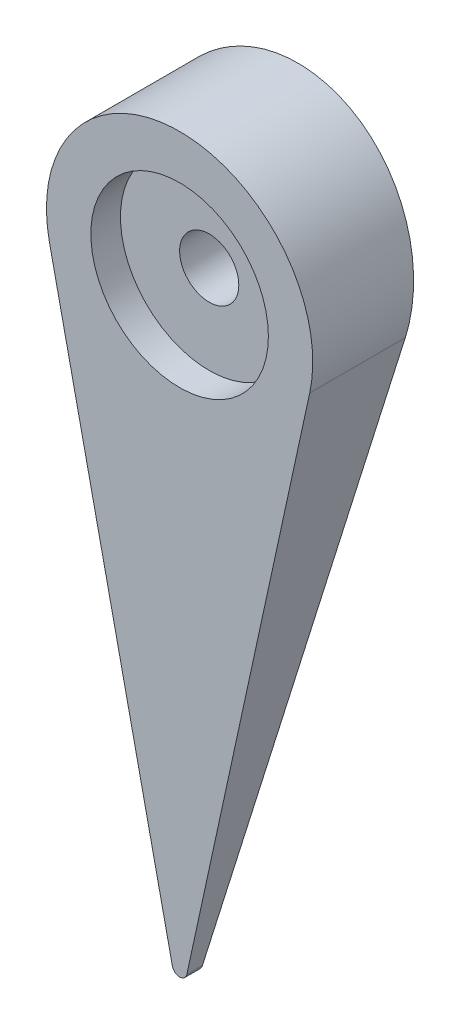
ISO-10303-21;
HEADER;
FILE_DESCRIPTION(('STEP AP214'),'2;1');
FILE_NAME('part.step','',(''),(''),'','','');
FILE_SCHEMA(('AUTOMOTIVE_DESIGN { 1 0 10303 214 1 1 1 1 }'));
ENDSEC;
DATA;
#1=APPLICATION_CONTEXT('core data for automotive mechanical design processes');
#2=APPLICATION_PROTOCOL_DEFINITION('international standard','automotive_design',2000,#1);
#3=PRODUCT_CONTEXT('',#1,'mechanical');
#4=PRODUCT('Part','Part','',(#3));
#5=PRODUCT_RELATED_PRODUCT_CATEGORY('part','',(#4));
#6=PRODUCT_DEFINITION_FORMATION('','',#4);
#7=PRODUCT_DEFINITION_CONTEXT('part definition',#1,'design');
#8=PRODUCT_DEFINITION('design','',#6,#7);
#9=PRODUCT_DEFINITION_SHAPE('','',#8);
#10=(LENGTH_UNIT() NAMED_UNIT(*) SI_UNIT(.MILLI.,.METRE.));
#11=(NAMED_UNIT(*) PLANE_ANGLE_UNIT() SI_UNIT($,.RADIAN.));
#12=(NAMED_UNIT(*) SI_UNIT($,.STERADIAN.) SOLID_ANGLE_UNIT());
#13=UNCERTAINTY_MEASURE_WITH_UNIT(LENGTH_MEASURE(1.E-05),#10,'distance_accuracy_value','');
#14=(GEOMETRIC_REPRESENTATION_CONTEXT(3) GLOBAL_UNCERTAINTY_ASSIGNED_CONTEXT((#13)) GLOBAL_UNIT_ASSIGNED_CONTEXT((#10,
#11,#12)) REPRESENTATION_CONTEXT('',''));
#15=CARTESIAN_POINT('',(0.,0.,0.));
#16=DIRECTION('',(0.,0.,1.));
#17=DIRECTION('',(1.,0.,0.));
#18=AXIS2_PLACEMENT_3D('',#15,#16,#17);
#19=CARTESIAN_POINT('',(0.,0.,5.));
#20=DIRECTION('',(0.,0.,-1.));
#21=DIRECTION('',(-1.,0.,0.));
#22=AXIS2_PLACEMENT_3D('',#19,#20,#21);
#23=CYLINDRICAL_SURFACE('',#22,1.);
#24=CARTESIAN_POINT('',(0.,0.,1.63636363636364));
#25=DIRECTION('',(0.,-0.140021004726182,-0.990148533420855));
#26=DIRECTION('',(0.,0.990148533420855,-0.140021004726182));
#27=AXIS2_PLACEMENT_3D('',#24,#25,#26);
#28=ELLIPSE('',#27,1.00994948358415,1.);
#29=CARTESIAN_POINT('',(0.,1.,1.49494949494949));
#30=VERTEX_POINT('',#29);
#31=EDGE_CURVE('E96',#30,#30,#28,.T.);
#32=ORIENTED_EDGE('',*,*,#31,.T.);
#33=EDGE_LOOP('',(#32));
#34=FACE_BOUND('',#33,.T.);
#35=CARTESIAN_POINT('',(0.,0.,4.));
#36=DIRECTION('',(0.,0.,1.));
#37=DIRECTION('',(1.,0.,0.));
#38=AXIS2_PLACEMENT_3D('',#35,#36,#37);
#39=CIRCLE('',#38,1.);
#40=CARTESIAN_POINT('',(1.,0.,4.));
#41=VERTEX_POINT('',#40);
#42=EDGE_CURVE('E49',#41,#41,#39,.T.);
#43=ORIENTED_EDGE('',*,*,#42,.T.);
#44=EDGE_LOOP('',(#43));
#45=FACE_BOUND('',#44,.T.);
#46=ADVANCED_FACE('F45',(#34,#45),#23,.F.);
#47=CARTESIAN_POINT('',(0.,0.,5.));
#48=DIRECTION('',(0.,0.,-1.));
#49=DIRECTION('',(-1.,0.,0.));
#50=AXIS2_PLACEMENT_3D('',#47,#48,#49);
#51=CYLINDRICAL_SURFACE('',#50,4.5);
#52=CARTESIAN_POINT('',(0.,0.,1.63636363636364));
#53=DIRECTION('',(0.,-0.140021004726182,-0.990148533420855));
#54=DIRECTION('',(0.,0.990148533420855,-0.140021004726182));
#55=AXIS2_PLACEMENT_3D('',#52,#53,#54);
#56=ELLIPSE('',#55,4.54477267612869,4.5);
#57=CARTESIAN_POINT('',(-4.39722479951844,-0.95625,1.77159090909091));
#58=VERTEX_POINT('',#57);
#59=CARTESIAN_POINT('',(4.39722479951844,-0.956249999999999,1.77159090909091));
#60=VERTEX_POINT('',#59);
#61=EDGE_CURVE('E63',#58,#60,#56,.T.);
#62=ORIENTED_EDGE('',*,*,#61,.F.);
#63=DIRECTION('',(0.,0.,-1.));
#64=VECTOR('',#63,1.);
#65=CARTESIAN_POINT('',(-4.39722479951844,-0.95625,5.));
#66=LINE('',#65,#64);
#67=CARTESIAN_POINT('',(-4.39722479951844,-0.95625,5.));
#68=VERTEX_POINT('',#67);
#69=EDGE_CURVE('E11',#68,#58,#66,.T.);
#70=ORIENTED_EDGE('',*,*,#69,.F.);
#71=CARTESIAN_POINT('',(0.,0.,5.));
#72=DIRECTION('',(0.,0.,1.));
#73=DIRECTION('',(1.,0.,0.));
#74=AXIS2_PLACEMENT_3D('',#71,#72,#73);
#75=CIRCLE('',#74,4.5);
#76=CARTESIAN_POINT('',(4.39722479951844,-0.956249999999999,5.));
#77=VERTEX_POINT('',#76);
#78=EDGE_CURVE('E140',#77,#68,#75,.T.);
#79=ORIENTED_EDGE('',*,*,#78,.F.);
#80=DIRECTION('',(0.,0.,-1.));
#81=VECTOR('',#80,1.);
#82=CARTESIAN_POINT('',(4.39722479951844,-0.956249999999999,5.));
#83=LINE('',#82,#81);
#84=EDGE_CURVE('E110',#77,#60,#83,.T.);
#85=ORIENTED_EDGE('',*,*,#84,.T.);
#86=EDGE_LOOP('',(#62,#70,#79,#85));
#87=FACE_BOUND('',#86,.T.);
#88=ADVANCED_FACE('F47',(#87),#51,.T.);
#89=CARTESIAN_POINT('',(-4.39722479951844,-0.95625,5.));
#90=DIRECTION('',(0.977161066559654,0.2125,0.));
#91=DIRECTION('',(-0.2125,0.977161066559654,0.));
#92=AXIS2_PLACEMENT_3D('',#89,#90,#91);
#93=PLANE('',#92);
#94=DIRECTION('',(-0.210499764663119,0.96796317434715,-0.136883681220809));
#95=VECTOR('',#94,1.);
#96=CARTESIAN_POINT('',(-4.3042014758787,-1.38400891831877,1.8320820692572));
#97=LINE('',#96,#95);
#98=CARTESIAN_POINT('',(-0.24429026663991,-20.053125,4.47215909090909));
#99=VERTEX_POINT('',#98);
#100=EDGE_CURVE('E106',#99,#58,#97,.T.);
#101=ORIENTED_EDGE('',*,*,#100,.F.);
#102=DIRECTION('',(0.,0.,-1.));
#103=VECTOR('',#102,1.);
#104=CARTESIAN_POINT('',(-0.24429026663991,-20.053125,5.));
#105=LINE('',#104,#103);
#106=CARTESIAN_POINT('',(-0.24429026663991,-20.053125,5.));
#107=VERTEX_POINT('',#106);
#108=EDGE_CURVE('E55',#107,#99,#105,.T.);
#109=ORIENTED_EDGE('',*,*,#108,.F.);
#110=DIRECTION('',(0.2125,-0.977161066559654,0.));
#111=VECTOR('',#110,1.);
#112=CARTESIAN_POINT('',(-4.39722479951844,-0.95625,5.));
#113=LINE('',#112,#111);
#114=EDGE_CURVE('E143',#68,#107,#113,.T.);
#115=ORIENTED_EDGE('',*,*,#114,.F.);
#116=ORIENTED_EDGE('',*,*,#69,.T.);
#117=EDGE_LOOP('',(#101,#109,#115,#116));
#118=FACE_BOUND('',#117,.T.);
#119=ADVANCED_FACE('F153',(#118),#93,.F.);
#120=CARTESIAN_POINT('',(0.,-20.,5.));
#121=DIRECTION('',(0.,0.,-1.));
#122=DIRECTION('',(-1.,0.,0.));
#123=AXIS2_PLACEMENT_3D('',#120,#121,#122);
#124=CYLINDRICAL_SURFACE('',#123,0.25);
#125=ORIENTED_EDGE('',*,*,#108,.T.);
#126=CARTESIAN_POINT('',(0.,-20.,4.46464646464646));
#127=DIRECTION('',(0.,-0.140021004726182,-0.990148533420855));
#128=DIRECTION('',(0.,0.990148533420855,-0.140021004726182));
#129=AXIS2_PLACEMENT_3D('',#126,#127,#128);
#130=ELLIPSE('',#129,0.252487370896038,0.25);
#131=CARTESIAN_POINT('',(0.244290266639915,-20.053125,4.47215909090909));
#132=VERTEX_POINT('',#131);
#133=EDGE_CURVE('E90',#132,#99,#130,.T.);
#134=ORIENTED_EDGE('',*,*,#133,.F.);
#135=DIRECTION('',(0.,0.,-1.));
#136=VECTOR('',#135,1.);
#137=CARTESIAN_POINT('',(0.244290266639915,-20.053125,5.));
#138=LINE('',#137,#136);
#139=CARTESIAN_POINT('',(0.244290266639915,-20.053125,5.));
#140=VERTEX_POINT('',#139);
#141=EDGE_CURVE('E103',#140,#132,#138,.T.);
#142=ORIENTED_EDGE('',*,*,#141,.F.);
#143=CARTESIAN_POINT('',(0.,-20.,5.));
#144=DIRECTION('',(0.,0.,1.));
#145=DIRECTION('',(1.,0.,0.));
#146=AXIS2_PLACEMENT_3D('',#143,#144,#145);
#147=CIRCLE('',#146,0.25);
#148=EDGE_CURVE('E146',#107,#140,#147,.T.);
#149=ORIENTED_EDGE('',*,*,#148,.F.);
#150=EDGE_LOOP('',(#125,#134,#142,#149));
#151=FACE_BOUND('',#150,.T.);
#152=ADVANCED_FACE('F101',(#151),#124,.T.);
#153=CARTESIAN_POINT('',(4.39722479951844,-0.956249999999999,5.));
#154=DIRECTION('',(-0.977161066559654,0.2125,0.));
#155=DIRECTION('',(-0.2125,-0.977161066559654,0.));
#156=AXIS2_PLACEMENT_3D('',#153,#154,#155);
#157=PLANE('',#156);
#158=DIRECTION('',(-0.210499764663119,-0.96796317434715,0.136883681220809));
#159=VECTOR('',#158,1.);
#160=CARTESIAN_POINT('',(4.3042014758787,-1.38400891831876,1.8320820692572));
#161=LINE('',#160,#159);
#162=EDGE_CURVE('E87',#60,#132,#161,.T.);
#163=ORIENTED_EDGE('',*,*,#162,.F.);
#164=ORIENTED_EDGE('',*,*,#84,.F.);
#165=DIRECTION('',(0.2125,0.977161066559654,0.));
#166=VECTOR('',#165,1.);
#167=CARTESIAN_POINT('',(4.39722479951844,-0.956249999999999,5.));
#168=LINE('',#167,#166);
#169=EDGE_CURVE('E71',#140,#77,#168,.T.);
#170=ORIENTED_EDGE('',*,*,#169,.F.);
#171=ORIENTED_EDGE('',*,*,#141,.T.);
#172=EDGE_LOOP('',(#163,#164,#170,#171));
#173=FACE_BOUND('',#172,.T.);
#174=ADVANCED_FACE('F108',(#173),#157,.F.);
#175=CARTESIAN_POINT('',(0.,0.,5.));
#176=DIRECTION('',(0.,0.,1.));
#177=DIRECTION('',(1.,0.,0.));
#178=AXIS2_PLACEMENT_3D('',#175,#176,#177);
#179=PLANE('',#178);
#180=CARTESIAN_POINT('',(0.,0.,5.));
#181=DIRECTION('',(0.,0.,1.));
#182=DIRECTION('',(1.,0.,0.));
#183=AXIS2_PLACEMENT_3D('',#180,#181,#182);
#184=CIRCLE('',#183,3.);
#185=CARTESIAN_POINT('',(3.,0.,5.));
#186=VERTEX_POINT('',#185);
#187=EDGE_CURVE('E128',#186,#186,#184,.T.);
#188=ORIENTED_EDGE('',*,*,#187,.F.);
#189=EDGE_LOOP('',(#188));
#190=FACE_BOUND('',#189,.T.);
#191=ORIENTED_EDGE('',*,*,#78,.T.);
#192=ORIENTED_EDGE('',*,*,#114,.T.);
#193=ORIENTED_EDGE('',*,*,#148,.T.);
#194=ORIENTED_EDGE('',*,*,#169,.T.);
#195=EDGE_LOOP('',(#191,#192,#193,#194));
#196=FACE_BOUND('',#195,.T.);
#197=ADVANCED_FACE('F149',(#190,#196),#179,.T.);
#198=CARTESIAN_POINT('',(5.,-20.25,4.5));
#199=DIRECTION('',(0.,-0.140021004726182,-0.990148533420855));
#200=DIRECTION('',(0.,0.990148533420855,-0.140021004726182));
#201=AXIS2_PLACEMENT_3D('',#198,#199,#200);
#202=PLANE('',#201);
#203=ORIENTED_EDGE('',*,*,#31,.F.);
#204=EDGE_LOOP('',(#203));
#205=FACE_BOUND('',#204,.T.);
#206=ORIENTED_EDGE('',*,*,#61,.T.);
#207=ORIENTED_EDGE('',*,*,#162,.T.);
#208=ORIENTED_EDGE('',*,*,#133,.T.);
#209=ORIENTED_EDGE('',*,*,#100,.T.);
#210=EDGE_LOOP('',(#206,#207,#208,#209));
#211=FACE_BOUND('',#210,.T.);
#212=ADVANCED_FACE('F89',(#205,#211),#202,.T.);
#213=CARTESIAN_POINT('',(0.,0.,4.));
#214=DIRECTION('',(0.,0.,1.));
#215=DIRECTION('',(1.,0.,0.));
#216=AXIS2_PLACEMENT_3D('',#213,#214,#215);
#217=CYLINDRICAL_SURFACE('',#216,3.);
#218=CARTESIAN_POINT('',(0.,0.,4.));
#219=DIRECTION('',(0.,0.,1.));
#220=DIRECTION('',(1.,0.,0.));
#221=AXIS2_PLACEMENT_3D('',#218,#219,#220);
#222=CIRCLE('',#221,3.);
#223=CARTESIAN_POINT('',(3.,0.,4.));
#224=VERTEX_POINT('',#223);
#225=EDGE_CURVE('E123',#224,#224,#222,.T.);
#226=ORIENTED_EDGE('',*,*,#225,.F.);
#227=EDGE_LOOP('',(#226));
#228=FACE_BOUND('',#227,.T.);
#229=ORIENTED_EDGE('',*,*,#187,.T.);
#230=EDGE_LOOP('',(#229));
#231=FACE_BOUND('',#230,.T.);
#232=ADVANCED_FACE('F188',(#228,#231),#217,.F.);
#233=CARTESIAN_POINT('',(0.,0.,4.));
#234=DIRECTION('',(0.,0.,1.));
#235=DIRECTION('',(1.,0.,0.));
#236=AXIS2_PLACEMENT_3D('',#233,#234,#235);
#237=PLANE('',#236);
#238=ORIENTED_EDGE('',*,*,#42,.F.);
#239=EDGE_LOOP('',(#238));
#240=FACE_BOUND('',#239,.T.);
#241=ORIENTED_EDGE('',*,*,#225,.T.);
#242=EDGE_LOOP('',(#241));
#243=FACE_BOUND('',#242,.T.);
#244=ADVANCED_FACE('F207',(#240,#243),#237,.T.);
#245=CLOSED_SHELL('',(#46,#88,#119,#152,#174,#197,#212,#232,#244));
#246=MANIFOLD_SOLID_BREP('B2',#245);
#247=ADVANCED_BREP_SHAPE_REPRESENTATION('',(#18,#246),#14);
#248=SHAPE_DEFINITION_REPRESENTATION(#9,#247);
ENDSEC;
END-ISO-10303-21;
